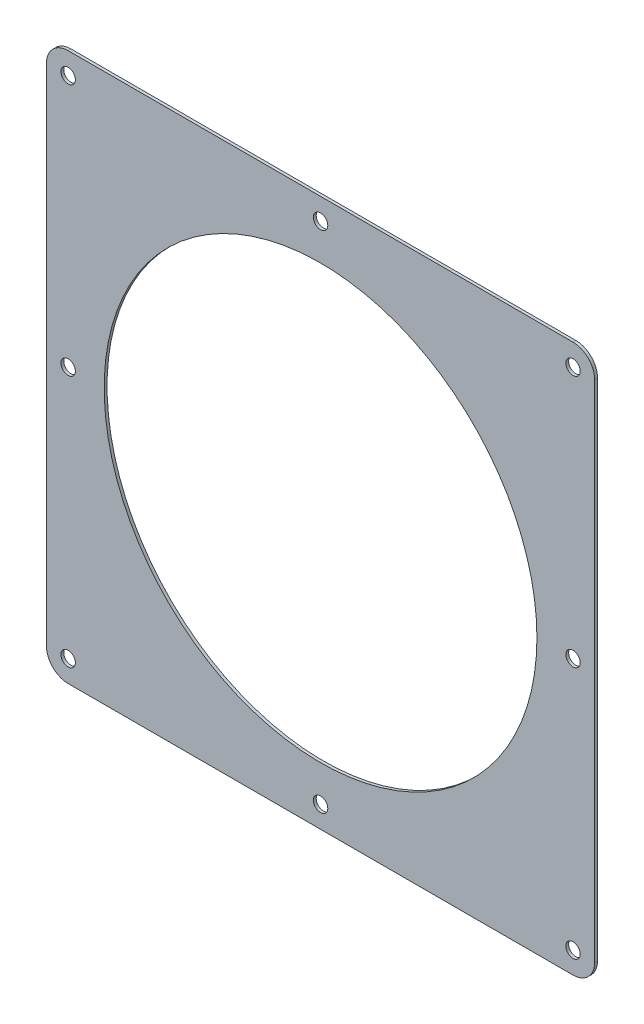
ISO-10303-21;
HEADER;
FILE_DESCRIPTION(('STEP AP214'),'2;1');
FILE_NAME('part.step','',(''),(''),'','','');
FILE_SCHEMA(('AUTOMOTIVE_DESIGN { 1 0 10303 214 1 1 1 1 }'));
ENDSEC;
DATA;
#1=APPLICATION_CONTEXT('core data for automotive mechanical design processes');
#2=APPLICATION_PROTOCOL_DEFINITION('international standard','automotive_design',2000,#1);
#3=PRODUCT_CONTEXT('',#1,'mechanical');
#4=PRODUCT('Part','Part','',(#3));
#5=PRODUCT_RELATED_PRODUCT_CATEGORY('part','',(#4));
#6=PRODUCT_DEFINITION_FORMATION('','',#4);
#7=PRODUCT_DEFINITION_CONTEXT('part definition',#1,'design');
#8=PRODUCT_DEFINITION('design','',#6,#7);
#9=PRODUCT_DEFINITION_SHAPE('','',#8);
#10=(LENGTH_UNIT() NAMED_UNIT(*) SI_UNIT(.MILLI.,.METRE.));
#11=(NAMED_UNIT(*) PLANE_ANGLE_UNIT() SI_UNIT($,.RADIAN.));
#12=(NAMED_UNIT(*) SI_UNIT($,.STERADIAN.) SOLID_ANGLE_UNIT());
#13=UNCERTAINTY_MEASURE_WITH_UNIT(LENGTH_MEASURE(1.E-05),#10,'distance_accuracy_value','');
#14=(GEOMETRIC_REPRESENTATION_CONTEXT(3) GLOBAL_UNCERTAINTY_ASSIGNED_CONTEXT((#13)) GLOBAL_UNIT_ASSIGNED_CONTEXT((#10,
#11,#12)) REPRESENTATION_CONTEXT('',''));
#15=CARTESIAN_POINT('',(0.,0.,0.));
#16=DIRECTION('',(0.,0.,1.));
#17=DIRECTION('',(1.,0.,0.));
#18=AXIS2_PLACEMENT_3D('',#15,#16,#17);
#19=CARTESIAN_POINT('',(-175.,-175.,2.));
#20=DIRECTION('',(0.,0.,1.));
#21=DIRECTION('',(1.,0.,0.));
#22=AXIS2_PLACEMENT_3D('',#19,#20,#21);
#23=PLANE('',#22);
#24=CARTESIAN_POINT('',(175.,-175.,2.));
#25=DIRECTION('',(0.,0.,1.));
#26=DIRECTION('',(1.,0.,0.));
#27=AXIS2_PLACEMENT_3D('',#24,#25,#26);
#28=CIRCLE('',#27,4.99999999999999);
#29=CARTESIAN_POINT('',(180.,-175.,2.));
#30=VERTEX_POINT('',#29);
#31=EDGE_CURVE('E217',#30,#30,#28,.T.);
#32=ORIENTED_EDGE('',*,*,#31,.F.);
#33=EDGE_LOOP('',(#32));
#34=FACE_BOUND('',#33,.T.);
#35=CARTESIAN_POINT('',(-175.,-175.,2.));
#36=DIRECTION('',(0.,0.,1.));
#37=DIRECTION('',(1.,0.,0.));
#38=AXIS2_PLACEMENT_3D('',#35,#36,#37);
#39=CIRCLE('',#38,4.99999999999999);
#40=CARTESIAN_POINT('',(-170.,-175.,2.));
#41=VERTEX_POINT('',#40);
#42=EDGE_CURVE('E205',#41,#41,#39,.T.);
#43=ORIENTED_EDGE('',*,*,#42,.F.);
#44=EDGE_LOOP('',(#43));
#45=FACE_BOUND('',#44,.T.);
#46=CARTESIAN_POINT('',(175.,0.,2.));
#47=DIRECTION('',(0.,0.,1.));
#48=DIRECTION('',(1.,0.,0.));
#49=AXIS2_PLACEMENT_3D('',#46,#47,#48);
#50=CIRCLE('',#49,5.00000000000002);
#51=CARTESIAN_POINT('',(180.,0.,2.));
#52=VERTEX_POINT('',#51);
#53=EDGE_CURVE('E193',#52,#52,#50,.T.);
#54=ORIENTED_EDGE('',*,*,#53,.F.);
#55=EDGE_LOOP('',(#54));
#56=FACE_BOUND('',#55,.T.);
#57=CARTESIAN_POINT('',(0.,175.,2.));
#58=DIRECTION('',(0.,0.,1.));
#59=DIRECTION('',(1.,0.,0.));
#60=AXIS2_PLACEMENT_3D('',#57,#58,#59);
#61=CIRCLE('',#60,5.00000000000001);
#62=CARTESIAN_POINT('',(5.00000000000001,175.,2.));
#63=VERTEX_POINT('',#62);
#64=EDGE_CURVE('E181',#63,#63,#61,.T.);
#65=ORIENTED_EDGE('',*,*,#64,.F.);
#66=EDGE_LOOP('',(#65));
#67=FACE_BOUND('',#66,.T.);
#68=CARTESIAN_POINT('',(-175.,-175.,2.));
#69=DIRECTION('',(0.,0.,1.));
#70=DIRECTION('',(1.,0.,0.));
#71=AXIS2_PLACEMENT_3D('',#68,#69,#70);
#72=CIRCLE('',#71,15.);
#73=CARTESIAN_POINT('',(-190.,-175.,2.));
#74=VERTEX_POINT('',#73);
#75=CARTESIAN_POINT('',(-175.,-190.,2.));
#76=VERTEX_POINT('',#75);
#77=EDGE_CURVE('E144',#74,#76,#72,.T.);
#78=ORIENTED_EDGE('',*,*,#77,.T.);
#79=DIRECTION('',(1.,0.,0.));
#80=VECTOR('',#79,1.);
#81=CARTESIAN_POINT('',(-175.,-190.,2.));
#82=LINE('',#81,#80);
#83=CARTESIAN_POINT('',(175.,-190.,2.));
#84=VERTEX_POINT('',#83);
#85=EDGE_CURVE('E92',#76,#84,#82,.T.);
#86=ORIENTED_EDGE('',*,*,#85,.T.);
#87=CARTESIAN_POINT('',(175.,-175.,2.));
#88=DIRECTION('',(0.,0.,1.));
#89=DIRECTION('',(1.,0.,0.));
#90=AXIS2_PLACEMENT_3D('',#87,#88,#89);
#91=CIRCLE('',#90,15.);
#92=CARTESIAN_POINT('',(190.,-175.,2.));
#93=VERTEX_POINT('',#92);
#94=EDGE_CURVE('E159',#84,#93,#91,.T.);
#95=ORIENTED_EDGE('',*,*,#94,.T.);
#96=DIRECTION('',(0.,1.,0.));
#97=VECTOR('',#96,1.);
#98=CARTESIAN_POINT('',(190.,175.,2.));
#99=LINE('',#98,#97);
#100=CARTESIAN_POINT('',(190.,175.,2.));
#101=VERTEX_POINT('',#100);
#102=EDGE_CURVE('E172',#93,#101,#99,.T.);
#103=ORIENTED_EDGE('',*,*,#102,.T.);
#104=CARTESIAN_POINT('',(175.,175.,2.));
#105=DIRECTION('',(0.,0.,1.));
#106=DIRECTION('',(-1.,0.,0.));
#107=AXIS2_PLACEMENT_3D('',#104,#105,#106);
#108=CIRCLE('',#107,15.);
#109=CARTESIAN_POINT('',(175.,190.,2.));
#110=VERTEX_POINT('',#109);
#111=EDGE_CURVE('E111',#101,#110,#108,.T.);
#112=ORIENTED_EDGE('',*,*,#111,.T.);
#113=DIRECTION('',(-1.,0.,0.));
#114=VECTOR('',#113,1.);
#115=CARTESIAN_POINT('',(-175.,190.,2.));
#116=LINE('',#115,#114);
#117=CARTESIAN_POINT('',(-175.,190.,2.));
#118=VERTEX_POINT('',#117);
#119=EDGE_CURVE('E105',#110,#118,#116,.T.);
#120=ORIENTED_EDGE('',*,*,#119,.T.);
#121=CARTESIAN_POINT('',(-175.,175.,2.));
#122=DIRECTION('',(0.,0.,1.));
#123=DIRECTION('',(1.,0.,0.));
#124=AXIS2_PLACEMENT_3D('',#121,#122,#123);
#125=CIRCLE('',#124,15.0000000000001);
#126=CARTESIAN_POINT('',(-190.,175.,2.));
#127=VERTEX_POINT('',#126);
#128=EDGE_CURVE('E109',#118,#127,#125,.T.);
#129=ORIENTED_EDGE('',*,*,#128,.T.);
#130=DIRECTION('',(0.,-1.,0.));
#131=VECTOR('',#130,1.);
#132=CARTESIAN_POINT('',(-190.,175.,2.));
#133=LINE('',#132,#131);
#134=EDGE_CURVE('E49',#127,#74,#133,.T.);
#135=ORIENTED_EDGE('',*,*,#134,.T.);
#136=EDGE_LOOP('',(#78,#86,#95,#103,#112,#120,#129,#135));
#137=FACE_BOUND('',#136,.T.);
#138=CARTESIAN_POINT('',(-175.,175.,2.));
#139=DIRECTION('',(0.,0.,1.));
#140=DIRECTION('',(1.,0.,0.));
#141=AXIS2_PLACEMENT_3D('',#138,#139,#140);
#142=CIRCLE('',#141,4.99999999999999);
#143=CARTESIAN_POINT('',(-170.,175.,2.));
#144=VERTEX_POINT('',#143);
#145=EDGE_CURVE('E133',#144,#144,#142,.T.);
#146=ORIENTED_EDGE('',*,*,#145,.F.);
#147=EDGE_LOOP('',(#146));
#148=FACE_BOUND('',#147,.T.);
#149=CARTESIAN_POINT('',(175.,175.,2.));
#150=DIRECTION('',(0.,0.,1.));
#151=DIRECTION('',(1.,0.,0.));
#152=AXIS2_PLACEMENT_3D('',#149,#150,#151);
#153=CIRCLE('',#152,4.99999999999999);
#154=CARTESIAN_POINT('',(180.,175.,2.));
#155=VERTEX_POINT('',#154);
#156=EDGE_CURVE('E187',#155,#155,#153,.T.);
#157=ORIENTED_EDGE('',*,*,#156,.F.);
#158=EDGE_LOOP('',(#157));
#159=FACE_BOUND('',#158,.T.);
#160=CARTESIAN_POINT('',(-175.,0.,2.));
#161=DIRECTION('',(0.,0.,1.));
#162=DIRECTION('',(1.,0.,0.));
#163=AXIS2_PLACEMENT_3D('',#160,#161,#162);
#164=CIRCLE('',#163,5.00000000000002);
#165=CARTESIAN_POINT('',(-170.,0.,2.));
#166=VERTEX_POINT('',#165);
#167=EDGE_CURVE('E199',#166,#166,#164,.T.);
#168=ORIENTED_EDGE('',*,*,#167,.F.);
#169=EDGE_LOOP('',(#168));
#170=FACE_BOUND('',#169,.T.);
#171=CARTESIAN_POINT('',(0.,-175.,2.));
#172=DIRECTION('',(0.,0.,1.));
#173=DIRECTION('',(1.,0.,0.));
#174=AXIS2_PLACEMENT_3D('',#171,#172,#173);
#175=CIRCLE('',#174,5.);
#176=CARTESIAN_POINT('',(5.,-175.,2.));
#177=VERTEX_POINT('',#176);
#178=EDGE_CURVE('E211',#177,#177,#175,.T.);
#179=ORIENTED_EDGE('',*,*,#178,.F.);
#180=EDGE_LOOP('',(#179));
#181=FACE_BOUND('',#180,.T.);
#182=CARTESIAN_POINT('',(0.,0.,2.));
#183=DIRECTION('',(0.,0.,1.));
#184=DIRECTION('',(1.,0.,0.));
#185=AXIS2_PLACEMENT_3D('',#182,#183,#184);
#186=CIRCLE('',#185,150.);
#187=CARTESIAN_POINT('',(150.,0.,2.));
#188=VERTEX_POINT('',#187);
#189=EDGE_CURVE('E223',#188,#188,#186,.T.);
#190=ORIENTED_EDGE('',*,*,#189,.F.);
#191=EDGE_LOOP('',(#190));
#192=FACE_BOUND('',#191,.T.);
#193=ADVANCED_FACE('F32',(#34,#45,#56,#67,#137,#148,#159,#170,#181,#192),#23,.T.);
#194=CARTESIAN_POINT('',(-175.,-175.,0.));
#195=DIRECTION('',(0.,0.,1.));
#196=DIRECTION('',(1.,0.,0.));
#197=AXIS2_PLACEMENT_3D('',#194,#195,#196);
#198=PLANE('',#197);
#199=CARTESIAN_POINT('',(-175.,-175.,0.));
#200=DIRECTION('',(0.,0.,1.));
#201=DIRECTION('',(1.,0.,0.));
#202=AXIS2_PLACEMENT_3D('',#199,#200,#201);
#203=CIRCLE('',#202,15.);
#204=CARTESIAN_POINT('',(-190.,-175.,0.));
#205=VERTEX_POINT('',#204);
#206=CARTESIAN_POINT('',(-175.,-190.,0.));
#207=VERTEX_POINT('',#206);
#208=EDGE_CURVE('E129',#205,#207,#203,.T.);
#209=ORIENTED_EDGE('',*,*,#208,.F.);
#210=DIRECTION('',(0.,-1.,0.));
#211=VECTOR('',#210,1.);
#212=CARTESIAN_POINT('',(-190.,175.,0.));
#213=LINE('',#212,#211);
#214=CARTESIAN_POINT('',(-190.,175.,0.));
#215=VERTEX_POINT('',#214);
#216=EDGE_CURVE('E84',#215,#205,#213,.T.);
#217=ORIENTED_EDGE('',*,*,#216,.F.);
#218=CARTESIAN_POINT('',(-175.,175.,0.));
#219=DIRECTION('',(0.,0.,1.));
#220=DIRECTION('',(1.,0.,0.));
#221=AXIS2_PLACEMENT_3D('',#218,#219,#220);
#222=CIRCLE('',#221,15.0000000000001);
#223=CARTESIAN_POINT('',(-175.,190.,0.));
#224=VERTEX_POINT('',#223);
#225=EDGE_CURVE('E78',#224,#215,#222,.T.);
#226=ORIENTED_EDGE('',*,*,#225,.F.);
#227=DIRECTION('',(-1.,0.,0.));
#228=VECTOR('',#227,1.);
#229=CARTESIAN_POINT('',(-175.,190.,0.));
#230=LINE('',#229,#228);
#231=CARTESIAN_POINT('',(175.,190.,0.));
#232=VERTEX_POINT('',#231);
#233=EDGE_CURVE('E119',#232,#224,#230,.T.);
#234=ORIENTED_EDGE('',*,*,#233,.F.);
#235=CARTESIAN_POINT('',(175.,175.,0.));
#236=DIRECTION('',(0.,0.,1.));
#237=DIRECTION('',(-1.,0.,0.));
#238=AXIS2_PLACEMENT_3D('',#235,#236,#237);
#239=CIRCLE('',#238,15.);
#240=CARTESIAN_POINT('',(190.,175.,0.));
#241=VERTEX_POINT('',#240);
#242=EDGE_CURVE('E139',#241,#232,#239,.T.);
#243=ORIENTED_EDGE('',*,*,#242,.F.);
#244=DIRECTION('',(0.,1.,0.));
#245=VECTOR('',#244,1.);
#246=CARTESIAN_POINT('',(190.,175.,0.));
#247=LINE('',#246,#245);
#248=CARTESIAN_POINT('',(190.,-175.,0.));
#249=VERTEX_POINT('',#248);
#250=EDGE_CURVE('E137',#249,#241,#247,.T.);
#251=ORIENTED_EDGE('',*,*,#250,.F.);
#252=CARTESIAN_POINT('',(175.,-175.,0.));
#253=DIRECTION('',(0.,0.,1.));
#254=DIRECTION('',(1.,0.,0.));
#255=AXIS2_PLACEMENT_3D('',#252,#253,#254);
#256=CIRCLE('',#255,15.);
#257=CARTESIAN_POINT('',(175.,-190.,0.));
#258=VERTEX_POINT('',#257);
#259=EDGE_CURVE('E135',#258,#249,#256,.T.);
#260=ORIENTED_EDGE('',*,*,#259,.F.);
#261=DIRECTION('',(1.,0.,0.));
#262=VECTOR('',#261,1.);
#263=CARTESIAN_POINT('',(-175.,-190.,0.));
#264=LINE('',#263,#262);
#265=EDGE_CURVE('E132',#207,#258,#264,.T.);
#266=ORIENTED_EDGE('',*,*,#265,.F.);
#267=EDGE_LOOP('',(#209,#217,#226,#234,#243,#251,#260,#266));
#268=FACE_BOUND('',#267,.T.);
#269=CARTESIAN_POINT('',(-175.,175.,0.));
#270=DIRECTION('',(0.,0.,1.));
#271=DIRECTION('',(1.,0.,0.));
#272=AXIS2_PLACEMENT_3D('',#269,#270,#271);
#273=CIRCLE('',#272,4.99999999999999);
#274=CARTESIAN_POINT('',(-170.,175.,0.));
#275=VERTEX_POINT('',#274);
#276=EDGE_CURVE('E178',#275,#275,#273,.T.);
#277=ORIENTED_EDGE('',*,*,#276,.T.);
#278=EDGE_LOOP('',(#277));
#279=FACE_BOUND('',#278,.T.);
#280=CARTESIAN_POINT('',(0.,175.,0.));
#281=DIRECTION('',(0.,0.,1.));
#282=DIRECTION('',(1.,0.,0.));
#283=AXIS2_PLACEMENT_3D('',#280,#281,#282);
#284=CIRCLE('',#283,5.00000000000001);
#285=CARTESIAN_POINT('',(5.00000000000001,175.,0.));
#286=VERTEX_POINT('',#285);
#287=EDGE_CURVE('E184',#286,#286,#284,.T.);
#288=ORIENTED_EDGE('',*,*,#287,.T.);
#289=EDGE_LOOP('',(#288));
#290=FACE_BOUND('',#289,.T.);
#291=CARTESIAN_POINT('',(175.,175.,0.));
#292=DIRECTION('',(0.,0.,1.));
#293=DIRECTION('',(1.,0.,0.));
#294=AXIS2_PLACEMENT_3D('',#291,#292,#293);
#295=CIRCLE('',#294,4.99999999999999);
#296=CARTESIAN_POINT('',(180.,175.,0.));
#297=VERTEX_POINT('',#296);
#298=EDGE_CURVE('E190',#297,#297,#295,.T.);
#299=ORIENTED_EDGE('',*,*,#298,.T.);
#300=EDGE_LOOP('',(#299));
#301=FACE_BOUND('',#300,.T.);
#302=CARTESIAN_POINT('',(175.,0.,0.));
#303=DIRECTION('',(0.,0.,1.));
#304=DIRECTION('',(1.,0.,0.));
#305=AXIS2_PLACEMENT_3D('',#302,#303,#304);
#306=CIRCLE('',#305,5.00000000000002);
#307=CARTESIAN_POINT('',(180.,0.,0.));
#308=VERTEX_POINT('',#307);
#309=EDGE_CURVE('E196',#308,#308,#306,.T.);
#310=ORIENTED_EDGE('',*,*,#309,.T.);
#311=EDGE_LOOP('',(#310));
#312=FACE_BOUND('',#311,.T.);
#313=CARTESIAN_POINT('',(-175.,0.,0.));
#314=DIRECTION('',(0.,0.,1.));
#315=DIRECTION('',(1.,0.,0.));
#316=AXIS2_PLACEMENT_3D('',#313,#314,#315);
#317=CIRCLE('',#316,5.00000000000002);
#318=CARTESIAN_POINT('',(-170.,0.,0.));
#319=VERTEX_POINT('',#318);
#320=EDGE_CURVE('E202',#319,#319,#317,.T.);
#321=ORIENTED_EDGE('',*,*,#320,.T.);
#322=EDGE_LOOP('',(#321));
#323=FACE_BOUND('',#322,.T.);
#324=CARTESIAN_POINT('',(-175.,-175.,0.));
#325=DIRECTION('',(0.,0.,1.));
#326=DIRECTION('',(1.,0.,0.));
#327=AXIS2_PLACEMENT_3D('',#324,#325,#326);
#328=CIRCLE('',#327,4.99999999999999);
#329=CARTESIAN_POINT('',(-170.,-175.,0.));
#330=VERTEX_POINT('',#329);
#331=EDGE_CURVE('E208',#330,#330,#328,.T.);
#332=ORIENTED_EDGE('',*,*,#331,.T.);
#333=EDGE_LOOP('',(#332));
#334=FACE_BOUND('',#333,.T.);
#335=CARTESIAN_POINT('',(0.,-175.,0.));
#336=DIRECTION('',(0.,0.,1.));
#337=DIRECTION('',(1.,0.,0.));
#338=AXIS2_PLACEMENT_3D('',#335,#336,#337);
#339=CIRCLE('',#338,5.);
#340=CARTESIAN_POINT('',(5.,-175.,0.));
#341=VERTEX_POINT('',#340);
#342=EDGE_CURVE('E214',#341,#341,#339,.T.);
#343=ORIENTED_EDGE('',*,*,#342,.T.);
#344=EDGE_LOOP('',(#343));
#345=FACE_BOUND('',#344,.T.);
#346=CARTESIAN_POINT('',(175.,-175.,0.));
#347=DIRECTION('',(0.,0.,1.));
#348=DIRECTION('',(1.,0.,0.));
#349=AXIS2_PLACEMENT_3D('',#346,#347,#348);
#350=CIRCLE('',#349,4.99999999999999);
#351=CARTESIAN_POINT('',(180.,-175.,0.));
#352=VERTEX_POINT('',#351);
#353=EDGE_CURVE('E220',#352,#352,#350,.T.);
#354=ORIENTED_EDGE('',*,*,#353,.T.);
#355=EDGE_LOOP('',(#354));
#356=FACE_BOUND('',#355,.T.);
#357=CARTESIAN_POINT('',(0.,0.,0.));
#358=DIRECTION('',(0.,0.,1.));
#359=DIRECTION('',(1.,0.,0.));
#360=AXIS2_PLACEMENT_3D('',#357,#358,#359);
#361=CIRCLE('',#360,150.);
#362=CARTESIAN_POINT('',(150.,0.,0.));
#363=VERTEX_POINT('',#362);
#364=EDGE_CURVE('E226',#363,#363,#361,.T.);
#365=ORIENTED_EDGE('',*,*,#364,.T.);
#366=EDGE_LOOP('',(#365));
#367=FACE_BOUND('',#366,.T.);
#368=ADVANCED_FACE('F163',(#268,#279,#290,#301,#312,#323,#334,#345,#356,#367),#198,.F.);
#369=CARTESIAN_POINT('',(-175.,-175.,2.));
#370=DIRECTION('',(0.,0.,-1.));
#371=DIRECTION('',(-1.,0.,0.));
#372=AXIS2_PLACEMENT_3D('',#369,#370,#371);
#373=CYLINDRICAL_SURFACE('',#372,15.);
#374=ORIENTED_EDGE('',*,*,#208,.T.);
#375=DIRECTION('',(0.,0.,-1.));
#376=VECTOR('',#375,1.);
#377=CARTESIAN_POINT('',(-175.,-190.,2.));
#378=LINE('',#377,#376);
#379=EDGE_CURVE('E11',#76,#207,#378,.T.);
#380=ORIENTED_EDGE('',*,*,#379,.F.);
#381=ORIENTED_EDGE('',*,*,#77,.F.);
#382=DIRECTION('',(0.,0.,-1.));
#383=VECTOR('',#382,1.);
#384=CARTESIAN_POINT('',(-190.,-175.,2.));
#385=LINE('',#384,#383);
#386=EDGE_CURVE('E125',#74,#205,#385,.T.);
#387=ORIENTED_EDGE('',*,*,#386,.T.);
#388=EDGE_LOOP('',(#374,#380,#381,#387));
#389=FACE_BOUND('',#388,.T.);
#390=ADVANCED_FACE('F34',(#389),#373,.T.);
#391=CARTESIAN_POINT('',(-175.,-190.,2.));
#392=DIRECTION('',(0.,1.,0.));
#393=DIRECTION('',(0.,0.,1.));
#394=AXIS2_PLACEMENT_3D('',#391,#392,#393);
#395=PLANE('',#394);
#396=ORIENTED_EDGE('',*,*,#265,.T.);
#397=DIRECTION('',(0.,0.,-1.));
#398=VECTOR('',#397,1.);
#399=CARTESIAN_POINT('',(175.,-190.,2.));
#400=LINE('',#399,#398);
#401=EDGE_CURVE('E41',#84,#258,#400,.T.);
#402=ORIENTED_EDGE('',*,*,#401,.F.);
#403=ORIENTED_EDGE('',*,*,#85,.F.);
#404=ORIENTED_EDGE('',*,*,#379,.T.);
#405=EDGE_LOOP('',(#396,#402,#403,#404));
#406=FACE_BOUND('',#405,.T.);
#407=ADVANCED_FACE('F260',(#406),#395,.F.);
#408=CARTESIAN_POINT('',(175.,-175.,2.));
#409=DIRECTION('',(0.,0.,-1.));
#410=DIRECTION('',(-1.,0.,0.));
#411=AXIS2_PLACEMENT_3D('',#408,#409,#410);
#412=CYLINDRICAL_SURFACE('',#411,15.);
#413=ORIENTED_EDGE('',*,*,#259,.T.);
#414=DIRECTION('',(0.,0.,-1.));
#415=VECTOR('',#414,1.);
#416=CARTESIAN_POINT('',(190.,-175.,2.));
#417=LINE('',#416,#415);
#418=EDGE_CURVE('E151',#93,#249,#417,.T.);
#419=ORIENTED_EDGE('',*,*,#418,.F.);
#420=ORIENTED_EDGE('',*,*,#94,.F.);
#421=ORIENTED_EDGE('',*,*,#401,.T.);
#422=EDGE_LOOP('',(#413,#419,#420,#421));
#423=FACE_BOUND('',#422,.T.);
#424=ADVANCED_FACE('F157',(#423),#412,.T.);
#425=CARTESIAN_POINT('',(190.,175.,2.));
#426=DIRECTION('',(-1.,0.,0.));
#427=DIRECTION('',(0.,-1.,0.));
#428=AXIS2_PLACEMENT_3D('',#425,#426,#427);
#429=PLANE('',#428);
#430=ORIENTED_EDGE('',*,*,#250,.T.);
#431=DIRECTION('',(0.,0.,-1.));
#432=VECTOR('',#431,1.);
#433=CARTESIAN_POINT('',(190.,175.,2.));
#434=LINE('',#433,#432);
#435=EDGE_CURVE('E148',#101,#241,#434,.T.);
#436=ORIENTED_EDGE('',*,*,#435,.F.);
#437=ORIENTED_EDGE('',*,*,#102,.F.);
#438=ORIENTED_EDGE('',*,*,#418,.T.);
#439=EDGE_LOOP('',(#430,#436,#437,#438));
#440=FACE_BOUND('',#439,.T.);
#441=ADVANCED_FACE('F168',(#440),#429,.F.);
#442=CARTESIAN_POINT('',(175.,175.,2.));
#443=DIRECTION('',(0.,0.,-1.));
#444=DIRECTION('',(-1.,0.,0.));
#445=AXIS2_PLACEMENT_3D('',#442,#443,#444);
#446=CYLINDRICAL_SURFACE('',#445,15.);
#447=ORIENTED_EDGE('',*,*,#242,.T.);
#448=DIRECTION('',(0.,0.,-1.));
#449=VECTOR('',#448,1.);
#450=CARTESIAN_POINT('',(175.,190.,2.));
#451=LINE('',#450,#449);
#452=EDGE_CURVE('E120',#110,#232,#451,.T.);
#453=ORIENTED_EDGE('',*,*,#452,.F.);
#454=ORIENTED_EDGE('',*,*,#111,.F.);
#455=ORIENTED_EDGE('',*,*,#435,.T.);
#456=EDGE_LOOP('',(#447,#453,#454,#455));
#457=FACE_BOUND('',#456,.T.);
#458=ADVANCED_FACE('F171',(#457),#446,.T.);
#459=CARTESIAN_POINT('',(-175.,190.,2.));
#460=DIRECTION('',(0.,-1.,0.));
#461=DIRECTION('',(0.,0.,-1.));
#462=AXIS2_PLACEMENT_3D('',#459,#460,#461);
#463=PLANE('',#462);
#464=ORIENTED_EDGE('',*,*,#233,.T.);
#465=DIRECTION('',(0.,0.,-1.));
#466=VECTOR('',#465,1.);
#467=CARTESIAN_POINT('',(-175.,190.,2.));
#468=LINE('',#467,#466);
#469=EDGE_CURVE('E116',#118,#224,#468,.T.);
#470=ORIENTED_EDGE('',*,*,#469,.F.);
#471=ORIENTED_EDGE('',*,*,#119,.F.);
#472=ORIENTED_EDGE('',*,*,#452,.T.);
#473=EDGE_LOOP('',(#464,#470,#471,#472));
#474=FACE_BOUND('',#473,.T.);
#475=ADVANCED_FACE('F117',(#474),#463,.F.);
#476=CARTESIAN_POINT('',(-175.,175.,2.));
#477=DIRECTION('',(0.,0.,-1.));
#478=DIRECTION('',(-1.,0.,0.));
#479=AXIS2_PLACEMENT_3D('',#476,#477,#478);
#480=CYLINDRICAL_SURFACE('',#479,15.0000000000001);
#481=ORIENTED_EDGE('',*,*,#225,.T.);
#482=DIRECTION('',(0.,0.,-1.));
#483=VECTOR('',#482,1.);
#484=CARTESIAN_POINT('',(-190.,175.,2.));
#485=LINE('',#484,#483);
#486=EDGE_CURVE('E121',#127,#215,#485,.T.);
#487=ORIENTED_EDGE('',*,*,#486,.F.);
#488=ORIENTED_EDGE('',*,*,#128,.F.);
#489=ORIENTED_EDGE('',*,*,#469,.T.);
#490=EDGE_LOOP('',(#481,#487,#488,#489));
#491=FACE_BOUND('',#490,.T.);
#492=ADVANCED_FACE('F123',(#491),#480,.T.);
#493=CARTESIAN_POINT('',(-190.,175.,2.));
#494=DIRECTION('',(1.,0.,0.));
#495=DIRECTION('',(0.,1.,0.));
#496=AXIS2_PLACEMENT_3D('',#493,#494,#495);
#497=PLANE('',#496);
#498=ORIENTED_EDGE('',*,*,#216,.T.);
#499=ORIENTED_EDGE('',*,*,#386,.F.);
#500=ORIENTED_EDGE('',*,*,#134,.F.);
#501=ORIENTED_EDGE('',*,*,#486,.T.);
#502=EDGE_LOOP('',(#498,#499,#500,#501));
#503=FACE_BOUND('',#502,.T.);
#504=ADVANCED_FACE('F248',(#503),#497,.F.);
#505=CARTESIAN_POINT('',(-175.,175.,2.));
#506=DIRECTION('',(0.,0.,-1.));
#507=DIRECTION('',(-1.,0.,0.));
#508=AXIS2_PLACEMENT_3D('',#505,#506,#507);
#509=CYLINDRICAL_SURFACE('',#508,4.99999999999999);
#510=ORIENTED_EDGE('',*,*,#145,.T.);
#511=EDGE_LOOP('',(#510));
#512=FACE_BOUND('',#511,.T.);
#513=ORIENTED_EDGE('',*,*,#276,.F.);
#514=EDGE_LOOP('',(#513));
#515=FACE_BOUND('',#514,.T.);
#516=ADVANCED_FACE('F245',(#512,#515),#509,.F.);
#517=CARTESIAN_POINT('',(0.,175.,2.));
#518=DIRECTION('',(0.,0.,-1.));
#519=DIRECTION('',(-1.,0.,0.));
#520=AXIS2_PLACEMENT_3D('',#517,#518,#519);
#521=CYLINDRICAL_SURFACE('',#520,5.00000000000001);
#522=ORIENTED_EDGE('',*,*,#64,.T.);
#523=EDGE_LOOP('',(#522));
#524=FACE_BOUND('',#523,.T.);
#525=ORIENTED_EDGE('',*,*,#287,.F.);
#526=EDGE_LOOP('',(#525));
#527=FACE_BOUND('',#526,.T.);
#528=ADVANCED_FACE('F324',(#524,#527),#521,.F.);
#529=CARTESIAN_POINT('',(175.,175.,2.));
#530=DIRECTION('',(0.,0.,-1.));
#531=DIRECTION('',(-1.,0.,0.));
#532=AXIS2_PLACEMENT_3D('',#529,#530,#531);
#533=CYLINDRICAL_SURFACE('',#532,4.99999999999999);
#534=ORIENTED_EDGE('',*,*,#156,.T.);
#535=EDGE_LOOP('',(#534));
#536=FACE_BOUND('',#535,.T.);
#537=ORIENTED_EDGE('',*,*,#298,.F.);
#538=EDGE_LOOP('',(#537));
#539=FACE_BOUND('',#538,.T.);
#540=ADVANCED_FACE('F332',(#536,#539),#533,.F.);
#541=CARTESIAN_POINT('',(175.,0.,2.));
#542=DIRECTION('',(0.,0.,-1.));
#543=DIRECTION('',(-1.,0.,0.));
#544=AXIS2_PLACEMENT_3D('',#541,#542,#543);
#545=CYLINDRICAL_SURFACE('',#544,5.00000000000002);
#546=ORIENTED_EDGE('',*,*,#53,.T.);
#547=EDGE_LOOP('',(#546));
#548=FACE_BOUND('',#547,.T.);
#549=ORIENTED_EDGE('',*,*,#309,.F.);
#550=EDGE_LOOP('',(#549));
#551=FACE_BOUND('',#550,.T.);
#552=ADVANCED_FACE('F340',(#548,#551),#545,.F.);
#553=CARTESIAN_POINT('',(-175.,0.,2.));
#554=DIRECTION('',(0.,0.,-1.));
#555=DIRECTION('',(-1.,0.,0.));
#556=AXIS2_PLACEMENT_3D('',#553,#554,#555);
#557=CYLINDRICAL_SURFACE('',#556,5.00000000000002);
#558=ORIENTED_EDGE('',*,*,#167,.T.);
#559=EDGE_LOOP('',(#558));
#560=FACE_BOUND('',#559,.T.);
#561=ORIENTED_EDGE('',*,*,#320,.F.);
#562=EDGE_LOOP('',(#561));
#563=FACE_BOUND('',#562,.T.);
#564=ADVANCED_FACE('F349',(#560,#563),#557,.F.);
#565=CARTESIAN_POINT('',(-175.,-175.,2.));
#566=DIRECTION('',(0.,0.,-1.));
#567=DIRECTION('',(-1.,0.,0.));
#568=AXIS2_PLACEMENT_3D('',#565,#566,#567);
#569=CYLINDRICAL_SURFACE('',#568,4.99999999999999);
#570=ORIENTED_EDGE('',*,*,#42,.T.);
#571=EDGE_LOOP('',(#570));
#572=FACE_BOUND('',#571,.T.);
#573=ORIENTED_EDGE('',*,*,#331,.F.);
#574=EDGE_LOOP('',(#573));
#575=FACE_BOUND('',#574,.T.);
#576=ADVANCED_FACE('F358',(#572,#575),#569,.F.);
#577=CARTESIAN_POINT('',(0.,-175.,2.));
#578=DIRECTION('',(0.,0.,-1.));
#579=DIRECTION('',(-1.,0.,0.));
#580=AXIS2_PLACEMENT_3D('',#577,#578,#579);
#581=CYLINDRICAL_SURFACE('',#580,5.);
#582=ORIENTED_EDGE('',*,*,#178,.T.);
#583=EDGE_LOOP('',(#582));
#584=FACE_BOUND('',#583,.T.);
#585=ORIENTED_EDGE('',*,*,#342,.F.);
#586=EDGE_LOOP('',(#585));
#587=FACE_BOUND('',#586,.T.);
#588=ADVANCED_FACE('F367',(#584,#587),#581,.F.);
#589=CARTESIAN_POINT('',(175.,-175.,2.));
#590=DIRECTION('',(0.,0.,-1.));
#591=DIRECTION('',(-1.,0.,0.));
#592=AXIS2_PLACEMENT_3D('',#589,#590,#591);
#593=CYLINDRICAL_SURFACE('',#592,4.99999999999999);
#594=ORIENTED_EDGE('',*,*,#31,.T.);
#595=EDGE_LOOP('',(#594));
#596=FACE_BOUND('',#595,.T.);
#597=ORIENTED_EDGE('',*,*,#353,.F.);
#598=EDGE_LOOP('',(#597));
#599=FACE_BOUND('',#598,.T.);
#600=ADVANCED_FACE('F376',(#596,#599),#593,.F.);
#601=CARTESIAN_POINT('',(0.,0.,2.));
#602=DIRECTION('',(0.,0.,-1.));
#603=DIRECTION('',(-1.,0.,0.));
#604=AXIS2_PLACEMENT_3D('',#601,#602,#603);
#605=CYLINDRICAL_SURFACE('',#604,150.);
#606=ORIENTED_EDGE('',*,*,#189,.T.);
#607=EDGE_LOOP('',(#606));
#608=FACE_BOUND('',#607,.T.);
#609=ORIENTED_EDGE('',*,*,#364,.F.);
#610=EDGE_LOOP('',(#609));
#611=FACE_BOUND('',#610,.T.);
#612=ADVANCED_FACE('F232',(#608,#611),#605,.F.);
#613=CLOSED_SHELL('',(#193,#368,#390,#407,#424,#441,#458,#475,#492,#504,#516,#528,#540,#552,
#564,#576,#588,#600,#612));
#614=MANIFOLD_SOLID_BREP('B2',#613);
#615=ADVANCED_BREP_SHAPE_REPRESENTATION('',(#18,#614),#14);
#616=SHAPE_DEFINITION_REPRESENTATION(#9,#615);
ENDSEC;
END-ISO-10303-21;
